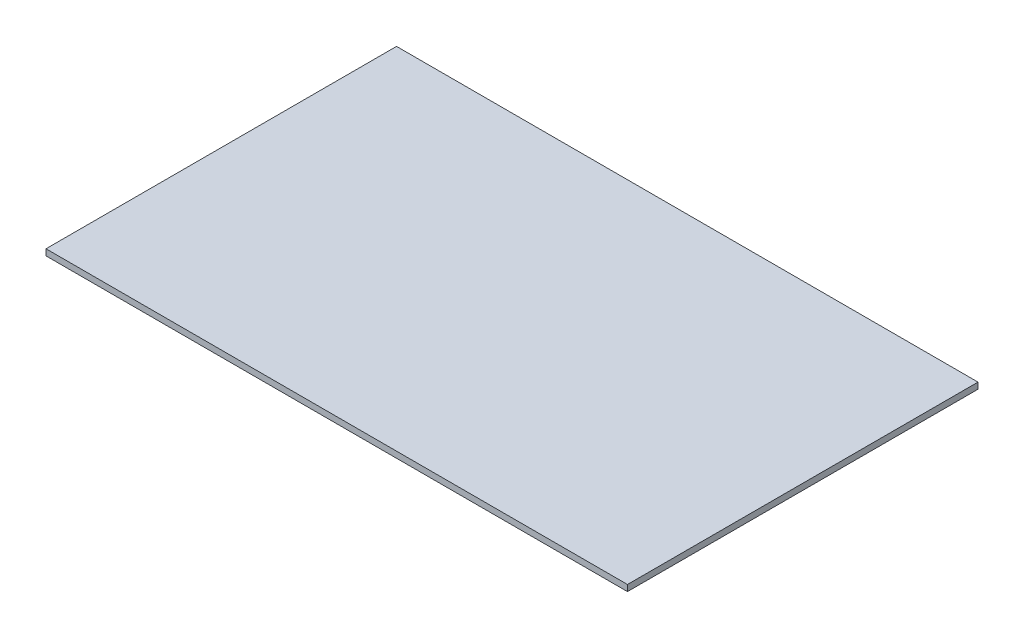
ISO-10303-21;
HEADER;
FILE_DESCRIPTION(('STEP AP214'),'2;1');
FILE_NAME('part.step','',(''),(''),'','','');
FILE_SCHEMA(('AUTOMOTIVE_DESIGN { 1 0 10303 214 1 1 1 1 }'));
ENDSEC;
DATA;
#1=APPLICATION_CONTEXT('core data for automotive mechanical design processes');
#2=APPLICATION_PROTOCOL_DEFINITION('international standard','automotive_design',2000,#1);
#3=PRODUCT_CONTEXT('',#1,'mechanical');
#4=PRODUCT('Part','Part','',(#3));
#5=PRODUCT_RELATED_PRODUCT_CATEGORY('part','',(#4));
#6=PRODUCT_DEFINITION_FORMATION('','',#4);
#7=PRODUCT_DEFINITION_CONTEXT('part definition',#1,'design');
#8=PRODUCT_DEFINITION('design','',#6,#7);
#9=PRODUCT_DEFINITION_SHAPE('','',#8);
#10=(LENGTH_UNIT() NAMED_UNIT(*) SI_UNIT(.MILLI.,.METRE.));
#11=(NAMED_UNIT(*) PLANE_ANGLE_UNIT() SI_UNIT($,.RADIAN.));
#12=(NAMED_UNIT(*) SI_UNIT($,.STERADIAN.) SOLID_ANGLE_UNIT());
#13=UNCERTAINTY_MEASURE_WITH_UNIT(LENGTH_MEASURE(1.E-05),#10,'distance_accuracy_value','');
#14=(GEOMETRIC_REPRESENTATION_CONTEXT(3) GLOBAL_UNCERTAINTY_ASSIGNED_CONTEXT((#13)) GLOBAL_UNIT_ASSIGNED_CONTEXT((#10,
#11,#12)) REPRESENTATION_CONTEXT('',''));
#15=CARTESIAN_POINT('',(0.,0.,0.));
#16=DIRECTION('',(0.,0.,1.));
#17=DIRECTION('',(1.,0.,0.));
#18=AXIS2_PLACEMENT_3D('',#15,#16,#17);
#19=CARTESIAN_POINT('',(-141.,1.5,85.));
#20=DIRECTION('',(1.,0.,0.));
#21=DIRECTION('',(0.,0.,-1.));
#22=AXIS2_PLACEMENT_3D('',#19,#20,#21);
#23=PLANE('',#22);
#24=DIRECTION('',(0.,0.,1.));
#25=VECTOR('',#24,1.);
#26=CARTESIAN_POINT('',(-141.,-1.5,85.));
#27=LINE('',#26,#25);
#28=CARTESIAN_POINT('',(-141.,-1.5,-85.));
#29=VERTEX_POINT('',#28);
#30=CARTESIAN_POINT('',(-141.,-1.5,85.));
#31=VERTEX_POINT('',#30);
#32=EDGE_CURVE('E95',#29,#31,#27,.T.);
#33=ORIENTED_EDGE('',*,*,#32,.T.);
#34=DIRECTION('',(0.,-1.,0.));
#35=VECTOR('',#34,1.);
#36=CARTESIAN_POINT('',(-141.,1.5,85.));
#37=LINE('',#36,#35);
#38=CARTESIAN_POINT('',(-141.,1.5,85.));
#39=VERTEX_POINT('',#38);
#40=EDGE_CURVE('E11',#39,#31,#37,.T.);
#41=ORIENTED_EDGE('',*,*,#40,.F.);
#42=DIRECTION('',(0.,0.,1.));
#43=VECTOR('',#42,1.);
#44=CARTESIAN_POINT('',(-141.,1.5,85.));
#45=LINE('',#44,#43);
#46=CARTESIAN_POINT('',(-141.,1.5,-85.));
#47=VERTEX_POINT('',#46);
#48=EDGE_CURVE('E83',#47,#39,#45,.T.);
#49=ORIENTED_EDGE('',*,*,#48,.F.);
#50=DIRECTION('',(0.,-1.,0.));
#51=VECTOR('',#50,1.);
#52=CARTESIAN_POINT('',(-141.,1.5,-85.));
#53=LINE('',#52,#51);
#54=EDGE_CURVE('E91',#47,#29,#53,.T.);
#55=ORIENTED_EDGE('',*,*,#54,.T.);
#56=EDGE_LOOP('',(#33,#41,#49,#55));
#57=FACE_BOUND('',#56,.T.);
#58=ADVANCED_FACE('F32',(#57),#23,.F.);
#59=CARTESIAN_POINT('',(141.,1.5,85.));
#60=DIRECTION('',(0.,0.,-1.));
#61=DIRECTION('',(-1.,0.,0.));
#62=AXIS2_PLACEMENT_3D('',#59,#60,#61);
#63=PLANE('',#62);
#64=DIRECTION('',(1.,0.,0.));
#65=VECTOR('',#64,1.);
#66=CARTESIAN_POINT('',(141.,-1.5,85.));
#67=LINE('',#66,#65);
#68=CARTESIAN_POINT('',(141.,-1.5,85.));
#69=VERTEX_POINT('',#68);
#70=EDGE_CURVE('E87',#31,#69,#67,.T.);
#71=ORIENTED_EDGE('',*,*,#70,.T.);
#72=DIRECTION('',(0.,-1.,0.));
#73=VECTOR('',#72,1.);
#74=CARTESIAN_POINT('',(141.,1.5,85.));
#75=LINE('',#74,#73);
#76=CARTESIAN_POINT('',(141.,1.5,85.));
#77=VERTEX_POINT('',#76);
#78=EDGE_CURVE('E40',#77,#69,#75,.T.);
#79=ORIENTED_EDGE('',*,*,#78,.F.);
#80=DIRECTION('',(1.,0.,0.));
#81=VECTOR('',#80,1.);
#82=CARTESIAN_POINT('',(141.,1.5,85.));
#83=LINE('',#82,#81);
#84=EDGE_CURVE('E78',#39,#77,#83,.T.);
#85=ORIENTED_EDGE('',*,*,#84,.F.);
#86=ORIENTED_EDGE('',*,*,#40,.T.);
#87=EDGE_LOOP('',(#71,#79,#85,#86));
#88=FACE_BOUND('',#87,.T.);
#89=ADVANCED_FACE('F86',(#88),#63,.F.);
#90=CARTESIAN_POINT('',(141.,1.5,85.));
#91=DIRECTION('',(-1.,0.,0.));
#92=DIRECTION('',(0.,0.,1.));
#93=AXIS2_PLACEMENT_3D('',#90,#91,#92);
#94=PLANE('',#93);
#95=DIRECTION('',(0.,0.,-1.));
#96=VECTOR('',#95,1.);
#97=CARTESIAN_POINT('',(141.,-1.5,85.));
#98=LINE('',#97,#96);
#99=CARTESIAN_POINT('',(141.,-1.5,-85.));
#100=VERTEX_POINT('',#99);
#101=EDGE_CURVE('E65',#69,#100,#98,.T.);
#102=ORIENTED_EDGE('',*,*,#101,.T.);
#103=DIRECTION('',(0.,-1.,0.));
#104=VECTOR('',#103,1.);
#105=CARTESIAN_POINT('',(141.,1.5,-85.));
#106=LINE('',#105,#104);
#107=CARTESIAN_POINT('',(141.,1.5,-85.));
#108=VERTEX_POINT('',#107);
#109=EDGE_CURVE('E88',#108,#100,#106,.T.);
#110=ORIENTED_EDGE('',*,*,#109,.F.);
#111=DIRECTION('',(0.,0.,-1.));
#112=VECTOR('',#111,1.);
#113=CARTESIAN_POINT('',(141.,1.5,85.));
#114=LINE('',#113,#112);
#115=EDGE_CURVE('E81',#77,#108,#114,.T.);
#116=ORIENTED_EDGE('',*,*,#115,.F.);
#117=ORIENTED_EDGE('',*,*,#78,.T.);
#118=EDGE_LOOP('',(#102,#110,#116,#117));
#119=FACE_BOUND('',#118,.T.);
#120=ADVANCED_FACE('F89',(#119),#94,.F.);
#121=CARTESIAN_POINT('',(141.,1.5,-85.));
#122=DIRECTION('',(0.,0.,1.));
#123=DIRECTION('',(1.,0.,0.));
#124=AXIS2_PLACEMENT_3D('',#121,#122,#123);
#125=PLANE('',#124);
#126=DIRECTION('',(-1.,0.,0.));
#127=VECTOR('',#126,1.);
#128=CARTESIAN_POINT('',(141.,-1.5,-85.));
#129=LINE('',#128,#127);
#130=EDGE_CURVE('E71',#100,#29,#129,.T.);
#131=ORIENTED_EDGE('',*,*,#130,.T.);
#132=ORIENTED_EDGE('',*,*,#54,.F.);
#133=DIRECTION('',(-1.,0.,0.));
#134=VECTOR('',#133,1.);
#135=CARTESIAN_POINT('',(141.,1.5,-85.));
#136=LINE('',#135,#134);
#137=EDGE_CURVE('E48',#108,#47,#136,.T.);
#138=ORIENTED_EDGE('',*,*,#137,.F.);
#139=ORIENTED_EDGE('',*,*,#109,.T.);
#140=EDGE_LOOP('',(#131,#132,#138,#139));
#141=FACE_BOUND('',#140,.T.);
#142=ADVANCED_FACE('F102',(#141),#125,.F.);
#143=CARTESIAN_POINT('',(0.,1.5,0.));
#144=DIRECTION('',(0.,1.,0.));
#145=DIRECTION('',(0.,0.,1.));
#146=AXIS2_PLACEMENT_3D('',#143,#144,#145);
#147=PLANE('',#146);
#148=ORIENTED_EDGE('',*,*,#48,.T.);
#149=ORIENTED_EDGE('',*,*,#84,.T.);
#150=ORIENTED_EDGE('',*,*,#115,.T.);
#151=ORIENTED_EDGE('',*,*,#137,.T.);
#152=EDGE_LOOP('',(#148,#149,#150,#151));
#153=FACE_BOUND('',#152,.T.);
#154=ADVANCED_FACE('F79',(#153),#147,.T.);
#155=CARTESIAN_POINT('',(0.,-1.5,0.));
#156=DIRECTION('',(0.,1.,0.));
#157=DIRECTION('',(0.,0.,1.));
#158=AXIS2_PLACEMENT_3D('',#155,#156,#157);
#159=PLANE('',#158);
#160=ORIENTED_EDGE('',*,*,#32,.F.);
#161=ORIENTED_EDGE('',*,*,#130,.F.);
#162=ORIENTED_EDGE('',*,*,#101,.F.);
#163=ORIENTED_EDGE('',*,*,#70,.F.);
#164=EDGE_LOOP('',(#160,#161,#162,#163));
#165=FACE_BOUND('',#164,.T.);
#166=ADVANCED_FACE('F105',(#165),#159,.F.);
#167=CLOSED_SHELL('',(#58,#89,#120,#142,#154,#166));
#168=MANIFOLD_SOLID_BREP('B2',#167);
#169=ADVANCED_BREP_SHAPE_REPRESENTATION('',(#18,#168),#14);
#170=SHAPE_DEFINITION_REPRESENTATION(#9,#169);
ENDSEC;
END-ISO-10303-21;
